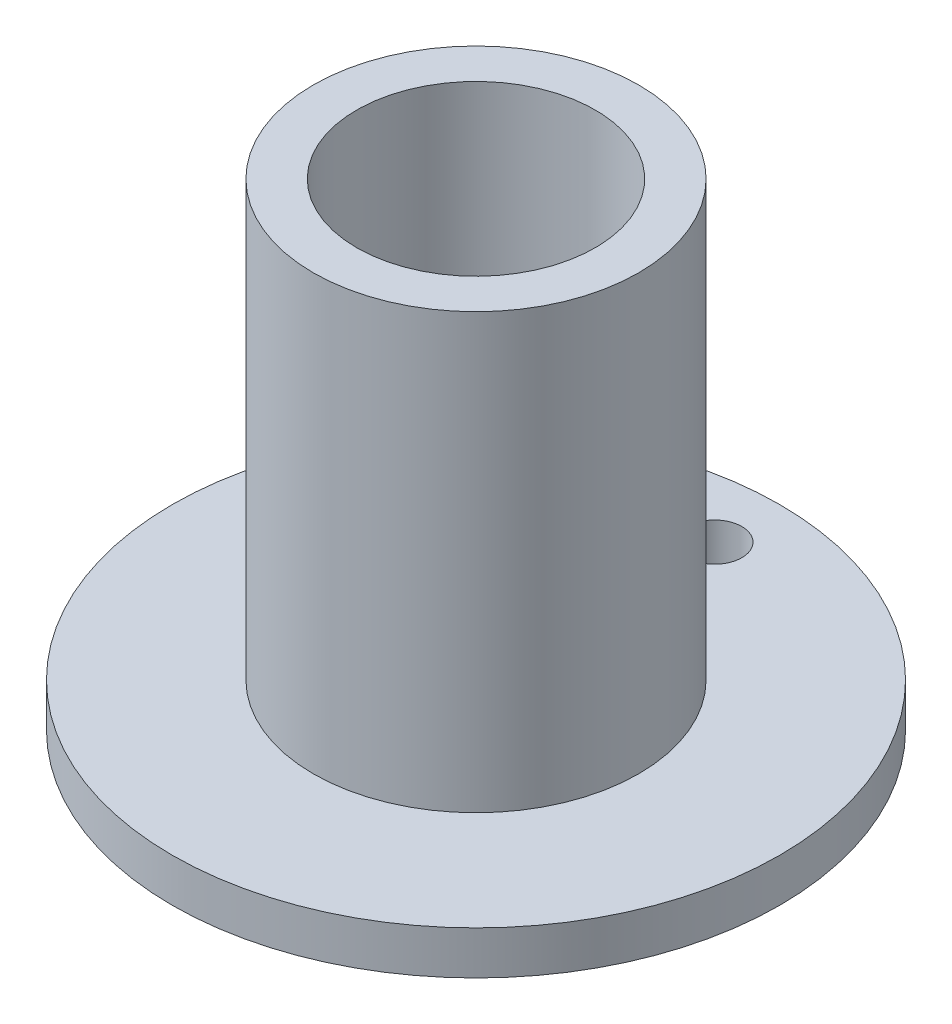
ISO-10303-21;
HEADER;
FILE_DESCRIPTION(('STEP AP214'),'2;1');
FILE_NAME('part.step','',(''),(''),'','','');
FILE_SCHEMA(('AUTOMOTIVE_DESIGN { 1 0 10303 214 1 1 1 1 }'));
ENDSEC;
DATA;
#1=APPLICATION_CONTEXT('core data for automotive mechanical design processes');
#2=APPLICATION_PROTOCOL_DEFINITION('international standard','automotive_design',2000,#1);
#3=PRODUCT_CONTEXT('',#1,'mechanical');
#4=PRODUCT('Part','Part','',(#3));
#5=PRODUCT_RELATED_PRODUCT_CATEGORY('part','',(#4));
#6=PRODUCT_DEFINITION_FORMATION('','',#4);
#7=PRODUCT_DEFINITION_CONTEXT('part definition',#1,'design');
#8=PRODUCT_DEFINITION('design','',#6,#7);
#9=PRODUCT_DEFINITION_SHAPE('','',#8);
#10=(LENGTH_UNIT() NAMED_UNIT(*) SI_UNIT(.MILLI.,.METRE.));
#11=(NAMED_UNIT(*) PLANE_ANGLE_UNIT() SI_UNIT($,.RADIAN.));
#12=(NAMED_UNIT(*) SI_UNIT($,.STERADIAN.) SOLID_ANGLE_UNIT());
#13=UNCERTAINTY_MEASURE_WITH_UNIT(LENGTH_MEASURE(1.E-05),#10,'distance_accuracy_value','');
#14=(GEOMETRIC_REPRESENTATION_CONTEXT(3) GLOBAL_UNCERTAINTY_ASSIGNED_CONTEXT((#13)) GLOBAL_UNIT_ASSIGNED_CONTEXT((#10,
#11,#12)) REPRESENTATION_CONTEXT('',''));
#15=CARTESIAN_POINT('',(0.,0.,0.));
#16=DIRECTION('',(0.,0.,1.));
#17=DIRECTION('',(1.,0.,0.));
#18=AXIS2_PLACEMENT_3D('',#15,#16,#17);
#19=CARTESIAN_POINT('',(0.,2.,0.));
#20=DIRECTION('',(0.,1.,0.));
#21=DIRECTION('',(0.,0.,1.));
#22=AXIS2_PLACEMENT_3D('',#19,#20,#21);
#23=PLANE('',#22);
#24=CARTESIAN_POINT('',(0.,2.,0.));
#25=DIRECTION('',(0.,1.,0.));
#26=DIRECTION('',(0.,0.,1.));
#27=AXIS2_PLACEMENT_3D('',#24,#25,#26);
#28=CIRCLE('',#27,14.);
#29=CARTESIAN_POINT('',(0.,2.,14.));
#30=VERTEX_POINT('',#29);
#31=EDGE_CURVE('E10',#30,#30,#28,.T.);
#32=ORIENTED_EDGE('',*,*,#31,.T.);
#33=EDGE_LOOP('',(#32));
#34=FACE_BOUND('',#33,.T.);
#35=CARTESIAN_POINT('',(0.,2.,-11.));
#36=DIRECTION('',(0.,1.,0.));
#37=DIRECTION('',(0.,0.,1.));
#38=AXIS2_PLACEMENT_3D('',#35,#36,#37);
#39=CIRCLE('',#38,1.25);
#40=CARTESIAN_POINT('',(0.,2.,-9.75));
#41=VERTEX_POINT('',#40);
#42=EDGE_CURVE('E48',#41,#41,#39,.T.);
#43=ORIENTED_EDGE('',*,*,#42,.F.);
#44=EDGE_LOOP('',(#43));
#45=FACE_BOUND('',#44,.T.);
#46=CARTESIAN_POINT('',(0.,2.,0.));
#47=DIRECTION('',(0.,1.,0.));
#48=DIRECTION('',(0.,0.,1.));
#49=AXIS2_PLACEMENT_3D('',#46,#47,#48);
#50=CIRCLE('',#49,7.5);
#51=CARTESIAN_POINT('',(0.,2.,7.5));
#52=VERTEX_POINT('',#51);
#53=EDGE_CURVE('E52',#52,#52,#50,.T.);
#54=ORIENTED_EDGE('',*,*,#53,.F.);
#55=EDGE_LOOP('',(#54));
#56=FACE_BOUND('',#55,.T.);
#57=ADVANCED_FACE('F30',(#34,#45,#56),#23,.T.);
#58=CARTESIAN_POINT('',(0.,0.,0.));
#59=DIRECTION('',(0.,1.,0.));
#60=DIRECTION('',(0.,0.,1.));
#61=AXIS2_PLACEMENT_3D('',#58,#59,#60);
#62=PLANE('',#61);
#63=CARTESIAN_POINT('',(0.,0.,-11.));
#64=DIRECTION('',(0.,1.,0.));
#65=DIRECTION('',(0.,0.,1.));
#66=AXIS2_PLACEMENT_3D('',#63,#64,#65);
#67=CIRCLE('',#66,1.25);
#68=CARTESIAN_POINT('',(0.,0.,-9.75));
#69=VERTEX_POINT('',#68);
#70=EDGE_CURVE('E45',#69,#69,#67,.F.);
#71=ORIENTED_EDGE('',*,*,#70,.F.);
#72=EDGE_LOOP('',(#71));
#73=FACE_BOUND('',#72,.T.);
#74=CARTESIAN_POINT('',(0.,0.,0.));
#75=DIRECTION('',(0.,1.,0.));
#76=DIRECTION('',(0.,0.,1.));
#77=AXIS2_PLACEMENT_3D('',#74,#75,#76);
#78=CIRCLE('',#77,14.);
#79=CARTESIAN_POINT('',(0.,0.,14.));
#80=VERTEX_POINT('',#79);
#81=EDGE_CURVE('E34',#80,#80,#78,.T.);
#82=ORIENTED_EDGE('',*,*,#81,.F.);
#83=EDGE_LOOP('',(#82));
#84=FACE_BOUND('',#83,.T.);
#85=CARTESIAN_POINT('',(0.,0.,0.));
#86=DIRECTION('',(0.,1.,0.));
#87=DIRECTION('',(0.,0.,1.));
#88=AXIS2_PLACEMENT_3D('',#85,#86,#87);
#89=CIRCLE('',#88,5.5);
#90=CARTESIAN_POINT('',(0.,0.,5.5));
#91=VERTEX_POINT('',#90);
#92=EDGE_CURVE('E41',#91,#91,#89,.T.);
#93=ORIENTED_EDGE('',*,*,#92,.T.);
#94=EDGE_LOOP('',(#93));
#95=FACE_BOUND('',#94,.T.);
#96=ADVANCED_FACE('F78',(#73,#84,#95),#62,.F.);
#97=CARTESIAN_POINT('',(0.,2.,0.));
#98=DIRECTION('',(0.,-1.,0.));
#99=DIRECTION('',(0.,0.,-1.));
#100=AXIS2_PLACEMENT_3D('',#97,#98,#99);
#101=CYLINDRICAL_SURFACE('',#100,14.);
#102=ORIENTED_EDGE('',*,*,#31,.F.);
#103=EDGE_LOOP('',(#102));
#104=FACE_BOUND('',#103,.T.);
#105=ORIENTED_EDGE('',*,*,#81,.T.);
#106=EDGE_LOOP('',(#105));
#107=FACE_BOUND('',#106,.T.);
#108=ADVANCED_FACE('F32',(#104,#107),#101,.T.);
#109=CARTESIAN_POINT('',(0.,2.,0.));
#110=DIRECTION('',(0.,-1.,0.));
#111=DIRECTION('',(0.,0.,-1.));
#112=AXIS2_PLACEMENT_3D('',#109,#110,#111);
#113=CYLINDRICAL_SURFACE('',#112,5.5);
#114=ORIENTED_EDGE('',*,*,#92,.F.);
#115=EDGE_LOOP('',(#114));
#116=FACE_BOUND('',#115,.T.);
#117=CARTESIAN_POINT('',(0.,22.,0.));
#118=DIRECTION('',(0.,1.,0.));
#119=DIRECTION('',(0.,0.,1.));
#120=AXIS2_PLACEMENT_3D('',#117,#118,#119);
#121=CIRCLE('',#120,5.5);
#122=CARTESIAN_POINT('',(0.,22.,5.5));
#123=VERTEX_POINT('',#122);
#124=EDGE_CURVE('E55',#123,#123,#121,.T.);
#125=ORIENTED_EDGE('',*,*,#124,.T.);
#126=EDGE_LOOP('',(#125));
#127=FACE_BOUND('',#126,.T.);
#128=ADVANCED_FACE('F61',(#116,#127),#113,.F.);
#129=CARTESIAN_POINT('',(0.,-3.53553390593274,-11.));
#130=DIRECTION('',(0.,1.,0.));
#131=DIRECTION('',(0.,0.,1.));
#132=AXIS2_PLACEMENT_3D('',#129,#130,#131);
#133=CYLINDRICAL_SURFACE('',#132,1.25);
#134=ORIENTED_EDGE('',*,*,#70,.T.);
#135=EDGE_LOOP('',(#134));
#136=FACE_BOUND('',#135,.T.);
#137=ORIENTED_EDGE('',*,*,#42,.T.);
#138=EDGE_LOOP('',(#137));
#139=FACE_BOUND('',#138,.T.);
#140=ADVANCED_FACE('F66',(#136,#139),#133,.F.);
#141=CARTESIAN_POINT('',(0.,22.,0.));
#142=DIRECTION('',(0.,1.,0.));
#143=DIRECTION('',(0.,0.,1.));
#144=AXIS2_PLACEMENT_3D('',#141,#142,#143);
#145=PLANE('',#144);
#146=CARTESIAN_POINT('',(0.,22.,0.));
#147=DIRECTION('',(0.,1.,0.));
#148=DIRECTION('',(0.,0.,1.));
#149=AXIS2_PLACEMENT_3D('',#146,#147,#148);
#150=CIRCLE('',#149,7.5);
#151=CARTESIAN_POINT('',(0.,22.,7.5));
#152=VERTEX_POINT('',#151);
#153=EDGE_CURVE('E51',#152,#152,#150,.T.);
#154=ORIENTED_EDGE('',*,*,#153,.T.);
#155=EDGE_LOOP('',(#154));
#156=FACE_BOUND('',#155,.T.);
#157=ORIENTED_EDGE('',*,*,#124,.F.);
#158=EDGE_LOOP('',(#157));
#159=FACE_BOUND('',#158,.T.);
#160=ADVANCED_FACE('F63',(#156,#159),#145,.T.);
#161=CARTESIAN_POINT('',(0.,22.,0.));
#162=DIRECTION('',(0.,-1.,0.));
#163=DIRECTION('',(0.,0.,-1.));
#164=AXIS2_PLACEMENT_3D('',#161,#162,#163);
#165=CYLINDRICAL_SURFACE('',#164,7.5);
#166=ORIENTED_EDGE('',*,*,#153,.F.);
#167=EDGE_LOOP('',(#166));
#168=FACE_BOUND('',#167,.T.);
#169=ORIENTED_EDGE('',*,*,#53,.T.);
#170=EDGE_LOOP('',(#169));
#171=FACE_BOUND('',#170,.T.);
#172=ADVANCED_FACE('F65',(#168,#171),#165,.T.);
#173=CLOSED_SHELL('',(#57,#96,#108,#128,#140,#160,#172));
#174=MANIFOLD_SOLID_BREP('B2',#173);
#175=ADVANCED_BREP_SHAPE_REPRESENTATION('',(#18,#174),#14);
#176=SHAPE_DEFINITION_REPRESENTATION(#9,#175);
ENDSEC;
END-ISO-10303-21;
